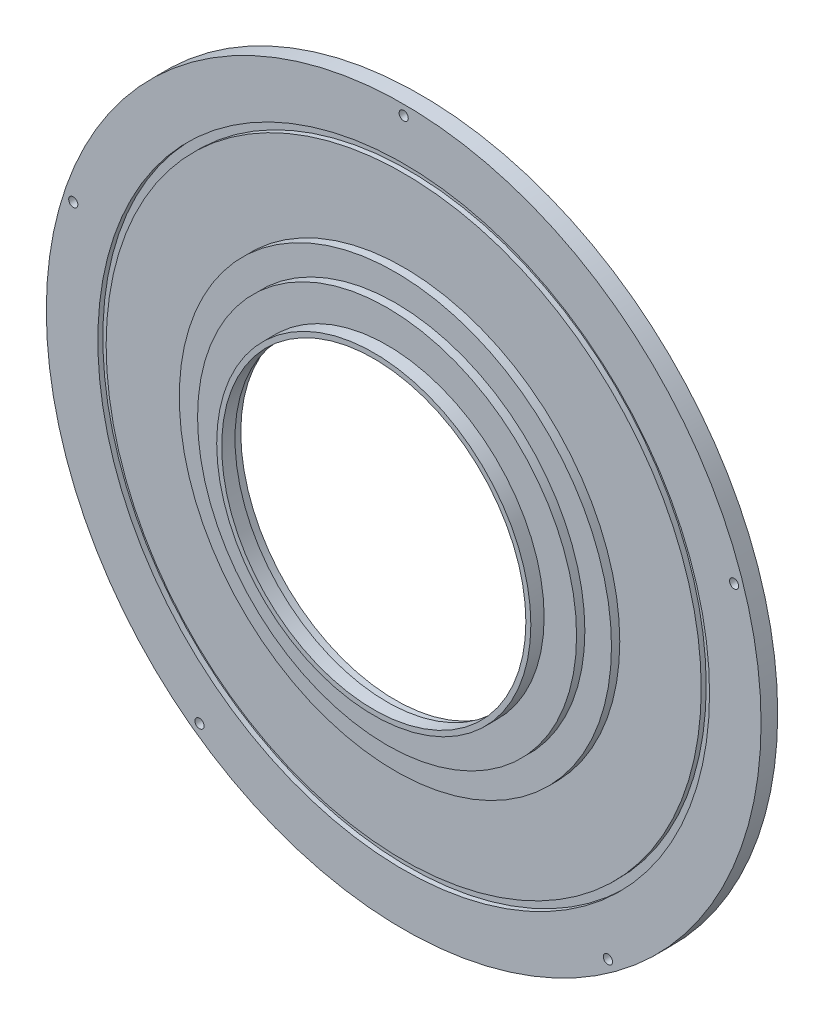
ISO-10303-21;
HEADER;
FILE_DESCRIPTION(('STEP AP214'),'2;1');
FILE_NAME('part.step','',(''),(''),'','','');
FILE_SCHEMA(('AUTOMOTIVE_DESIGN { 1 0 10303 214 1 1 1 1 }'));
ENDSEC;
DATA;
#1=APPLICATION_CONTEXT('core data for automotive mechanical design processes');
#2=APPLICATION_PROTOCOL_DEFINITION('international standard','automotive_design',2000,#1);
#3=PRODUCT_CONTEXT('',#1,'mechanical');
#4=PRODUCT('Part','Part','',(#3));
#5=PRODUCT_RELATED_PRODUCT_CATEGORY('part','',(#4));
#6=PRODUCT_DEFINITION_FORMATION('','',#4);
#7=PRODUCT_DEFINITION_CONTEXT('part definition',#1,'design');
#8=PRODUCT_DEFINITION('design','',#6,#7);
#9=PRODUCT_DEFINITION_SHAPE('','',#8);
#10=(LENGTH_UNIT() NAMED_UNIT(*) SI_UNIT(.MILLI.,.METRE.));
#11=(NAMED_UNIT(*) PLANE_ANGLE_UNIT() SI_UNIT($,.RADIAN.));
#12=(NAMED_UNIT(*) SI_UNIT($,.STERADIAN.) SOLID_ANGLE_UNIT());
#13=UNCERTAINTY_MEASURE_WITH_UNIT(LENGTH_MEASURE(1.E-05),#10,'distance_accuracy_value','');
#14=(GEOMETRIC_REPRESENTATION_CONTEXT(3) GLOBAL_UNCERTAINTY_ASSIGNED_CONTEXT((#13)) GLOBAL_UNIT_ASSIGNED_CONTEXT((#10,
#11,#12)) REPRESENTATION_CONTEXT('',''));
#15=CARTESIAN_POINT('',(0.,0.,0.));
#16=DIRECTION('',(0.,0.,1.));
#17=DIRECTION('',(1.,0.,0.));
#18=AXIS2_PLACEMENT_3D('',#15,#16,#17);
#19=CARTESIAN_POINT('',(0.,0.,10.));
#20=DIRECTION('',(0.,0.,1.));
#21=DIRECTION('',(1.,0.,0.));
#22=AXIS2_PLACEMENT_3D('',#19,#20,#21);
#23=PLANE('',#22);
#24=CARTESIAN_POINT('',(0.,0.,10.));
#25=DIRECTION('',(0.,0.,1.));
#26=DIRECTION('',(1.,0.,0.));
#27=AXIS2_PLACEMENT_3D('',#24,#25,#26);
#28=CIRCLE('',#27,130.);
#29=CARTESIAN_POINT('',(130.,0.,10.));
#30=VERTEX_POINT('',#29);
#31=EDGE_CURVE('E56',#30,#30,#28,.T.);
#32=ORIENTED_EDGE('',*,*,#31,.F.);
#33=EDGE_LOOP('',(#32));
#34=FACE_BOUND('',#33,.T.);
#35=CARTESIAN_POINT('',(0.,0.,10.));
#36=DIRECTION('',(0.,0.,1.));
#37=DIRECTION('',(1.,0.,0.));
#38=AXIS2_PLACEMENT_3D('',#35,#36,#37);
#39=CIRCLE('',#38,179.);
#40=CARTESIAN_POINT('',(179.,0.,10.));
#41=VERTEX_POINT('',#40);
#42=EDGE_CURVE('E107',#41,#41,#39,.T.);
#43=ORIENTED_EDGE('',*,*,#42,.T.);
#44=EDGE_LOOP('',(#43));
#45=FACE_BOUND('',#44,.T.);
#46=ADVANCED_FACE('F37',(#34,#45),#23,.T.);
#47=CARTESIAN_POINT('',(0.,0.,0.));
#48=DIRECTION('',(0.,0.,1.));
#49=DIRECTION('',(1.,0.,0.));
#50=AXIS2_PLACEMENT_3D('',#47,#48,#49);
#51=PLANE('',#50);
#52=CARTESIAN_POINT('',(0.,0.,0.));
#53=DIRECTION('',(0.,0.,1.));
#54=DIRECTION('',(1.,0.,0.));
#55=AXIS2_PLACEMENT_3D('',#52,#53,#54);
#56=CIRCLE('',#55,120.);
#57=CARTESIAN_POINT('',(120.,0.,0.));
#58=VERTEX_POINT('',#57);
#59=EDGE_CURVE('E48',#58,#58,#56,.T.);
#60=ORIENTED_EDGE('',*,*,#59,.T.);
#61=EDGE_LOOP('',(#60));
#62=FACE_BOUND('',#61,.T.);
#63=CARTESIAN_POINT('',(0.,0.,0.));
#64=DIRECTION('',(0.,0.,1.));
#65=DIRECTION('',(1.,0.,0.));
#66=AXIS2_PLACEMENT_3D('',#63,#64,#65);
#67=CIRCLE('',#66,144.);
#68=CARTESIAN_POINT('',(144.,0.,0.));
#69=VERTEX_POINT('',#68);
#70=EDGE_CURVE('E98',#69,#69,#67,.T.);
#71=ORIENTED_EDGE('',*,*,#70,.F.);
#72=EDGE_LOOP('',(#71));
#73=FACE_BOUND('',#72,.T.);
#74=ADVANCED_FACE('F153',(#62,#73),#51,.F.);
#75=CARTESIAN_POINT('',(198.770811905687,64.584551824364,10.));
#76=DIRECTION('',(0.,0.,1.));
#77=DIRECTION('',(1.,0.,0.));
#78=AXIS2_PLACEMENT_3D('',#75,#76,#77);
#79=CIRCLE('',#78,2.75);
#80=CARTESIAN_POINT('',(201.520811905687,64.584551824364,10.));
#81=VERTEX_POINT('',#80);
#82=EDGE_CURVE('E113',#81,#81,#79,.T.);
#83=ORIENTED_EDGE('',*,*,#82,.F.);
#84=EDGE_LOOP('',(#83));
#85=FACE_BOUND('',#84,.T.);
#86=CARTESIAN_POINT('',(0.,209.,10.));
#87=DIRECTION('',(0.,0.,1.));
#88=DIRECTION('',(1.,0.,0.));
#89=AXIS2_PLACEMENT_3D('',#86,#87,#88);
#90=CIRCLE('',#89,2.75);
#91=CARTESIAN_POINT('',(2.75000000000001,209.,10.));
#92=VERTEX_POINT('',#91);
#93=EDGE_CURVE('E134',#92,#92,#90,.T.);
#94=ORIENTED_EDGE('',*,*,#93,.F.);
#95=EDGE_LOOP('',(#94));
#96=FACE_BOUND('',#95,.T.);
#97=CARTESIAN_POINT('',(-198.770811905687,64.584551824364,10.));
#98=DIRECTION('',(0.,0.,1.));
#99=DIRECTION('',(1.,0.,0.));
#100=AXIS2_PLACEMENT_3D('',#97,#98,#99);
#101=CIRCLE('',#100,2.75);
#102=CARTESIAN_POINT('',(-196.020811905687,64.584551824364,10.));
#103=VERTEX_POINT('',#102);
#104=EDGE_CURVE('E128',#103,#103,#101,.T.);
#105=ORIENTED_EDGE('',*,*,#104,.F.);
#106=EDGE_LOOP('',(#105));
#107=FACE_BOUND('',#106,.T.);
#108=CARTESIAN_POINT('',(-122.847117729127,-169.084551824364,10.));
#109=DIRECTION('',(0.,0.,1.));
#110=DIRECTION('',(1.,0.,0.));
#111=AXIS2_PLACEMENT_3D('',#108,#109,#110);
#112=CIRCLE('',#111,2.75);
#113=CARTESIAN_POINT('',(-120.097117729127,-169.084551824364,10.));
#114=VERTEX_POINT('',#113);
#115=EDGE_CURVE('E122',#114,#114,#112,.T.);
#116=ORIENTED_EDGE('',*,*,#115,.F.);
#117=EDGE_LOOP('',(#116));
#118=FACE_BOUND('',#117,.T.);
#119=CARTESIAN_POINT('',(122.847117729127,-169.084551824364,10.));
#120=DIRECTION('',(0.,0.,1.));
#121=DIRECTION('',(1.,0.,0.));
#122=AXIS2_PLACEMENT_3D('',#119,#120,#121);
#123=CIRCLE('',#122,2.74999999999999);
#124=CARTESIAN_POINT('',(125.597117729127,-169.084551824364,10.));
#125=VERTEX_POINT('',#124);
#126=EDGE_CURVE('E116',#125,#125,#123,.T.);
#127=ORIENTED_EDGE('',*,*,#126,.F.);
#128=EDGE_LOOP('',(#127));
#129=FACE_BOUND('',#128,.T.);
#130=CARTESIAN_POINT('',(0.,0.,10.));
#131=DIRECTION('',(0.,0.,1.));
#132=DIRECTION('',(1.,0.,0.));
#133=AXIS2_PLACEMENT_3D('',#130,#131,#132);
#134=CIRCLE('',#133,184.);
#135=CARTESIAN_POINT('',(184.,0.,10.));
#136=VERTEX_POINT('',#135);
#137=EDGE_CURVE('E101',#136,#136,#134,.T.);
#138=ORIENTED_EDGE('',*,*,#137,.F.);
#139=EDGE_LOOP('',(#138));
#140=FACE_BOUND('',#139,.T.);
#141=CARTESIAN_POINT('',(0.,0.,10.));
#142=DIRECTION('',(0.,0.,1.));
#143=DIRECTION('',(1.,0.,0.));
#144=AXIS2_PLACEMENT_3D('',#141,#142,#143);
#145=CIRCLE('',#144,215.);
#146=CARTESIAN_POINT('',(215.,0.,10.));
#147=VERTEX_POINT('',#146);
#148=EDGE_CURVE('E10',#147,#147,#145,.T.);
#149=ORIENTED_EDGE('',*,*,#148,.T.);
#150=EDGE_LOOP('',(#149));
#151=FACE_BOUND('',#150,.T.);
#152=ADVANCED_FACE('F149',(#85,#96,#107,#118,#129,#140,#151),#23,.T.);
#153=CARTESIAN_POINT('',(198.770811905687,64.584551824364,0.));
#154=DIRECTION('',(0.,0.,1.));
#155=DIRECTION('',(1.,0.,0.));
#156=AXIS2_PLACEMENT_3D('',#153,#154,#155);
#157=CIRCLE('',#156,2.75);
#158=CARTESIAN_POINT('',(201.520811905687,64.584551824364,0.));
#159=VERTEX_POINT('',#158);
#160=EDGE_CURVE('E140',#159,#159,#157,.T.);
#161=ORIENTED_EDGE('',*,*,#160,.T.);
#162=EDGE_LOOP('',(#161));
#163=FACE_BOUND('',#162,.T.);
#164=CARTESIAN_POINT('',(0.,209.,0.));
#165=DIRECTION('',(0.,0.,1.));
#166=DIRECTION('',(1.,0.,0.));
#167=AXIS2_PLACEMENT_3D('',#164,#165,#166);
#168=CIRCLE('',#167,2.75);
#169=CARTESIAN_POINT('',(2.75000000000001,209.,0.));
#170=VERTEX_POINT('',#169);
#171=EDGE_CURVE('E137',#170,#170,#168,.T.);
#172=ORIENTED_EDGE('',*,*,#171,.T.);
#173=EDGE_LOOP('',(#172));
#174=FACE_BOUND('',#173,.T.);
#175=CARTESIAN_POINT('',(-198.770811905687,64.584551824364,0.));
#176=DIRECTION('',(0.,0.,1.));
#177=DIRECTION('',(1.,0.,0.));
#178=AXIS2_PLACEMENT_3D('',#175,#176,#177);
#179=CIRCLE('',#178,2.75);
#180=CARTESIAN_POINT('',(-196.020811905687,64.584551824364,0.));
#181=VERTEX_POINT('',#180);
#182=EDGE_CURVE('E131',#181,#181,#179,.T.);
#183=ORIENTED_EDGE('',*,*,#182,.T.);
#184=EDGE_LOOP('',(#183));
#185=FACE_BOUND('',#184,.T.);
#186=CARTESIAN_POINT('',(-122.847117729127,-169.084551824364,0.));
#187=DIRECTION('',(0.,0.,1.));
#188=DIRECTION('',(1.,0.,0.));
#189=AXIS2_PLACEMENT_3D('',#186,#187,#188);
#190=CIRCLE('',#189,2.75);
#191=CARTESIAN_POINT('',(-120.097117729127,-169.084551824364,0.));
#192=VERTEX_POINT('',#191);
#193=EDGE_CURVE('E125',#192,#192,#190,.T.);
#194=ORIENTED_EDGE('',*,*,#193,.T.);
#195=EDGE_LOOP('',(#194));
#196=FACE_BOUND('',#195,.T.);
#197=CARTESIAN_POINT('',(122.847117729127,-169.084551824364,0.));
#198=DIRECTION('',(0.,0.,1.));
#199=DIRECTION('',(1.,0.,0.));
#200=AXIS2_PLACEMENT_3D('',#197,#198,#199);
#201=CIRCLE('',#200,2.74999999999999);
#202=CARTESIAN_POINT('',(125.597117729127,-169.084551824364,0.));
#203=VERTEX_POINT('',#202);
#204=EDGE_CURVE('E119',#203,#203,#201,.T.);
#205=ORIENTED_EDGE('',*,*,#204,.T.);
#206=EDGE_LOOP('',(#205));
#207=FACE_BOUND('',#206,.T.);
#208=CARTESIAN_POINT('',(0.,0.,0.));
#209=DIRECTION('',(0.,0.,1.));
#210=DIRECTION('',(1.,0.,0.));
#211=AXIS2_PLACEMENT_3D('',#208,#209,#210);
#212=CIRCLE('',#211,204.);
#213=CARTESIAN_POINT('',(204.,0.,0.));
#214=VERTEX_POINT('',#213);
#215=EDGE_CURVE('E92',#214,#214,#212,.T.);
#216=ORIENTED_EDGE('',*,*,#215,.T.);
#217=EDGE_LOOP('',(#216));
#218=FACE_BOUND('',#217,.T.);
#219=CARTESIAN_POINT('',(0.,0.,0.));
#220=DIRECTION('',(0.,0.,1.));
#221=DIRECTION('',(1.,0.,0.));
#222=AXIS2_PLACEMENT_3D('',#219,#220,#221);
#223=CIRCLE('',#222,215.);
#224=CARTESIAN_POINT('',(215.,0.,0.));
#225=VERTEX_POINT('',#224);
#226=EDGE_CURVE('E41',#225,#225,#223,.T.);
#227=ORIENTED_EDGE('',*,*,#226,.F.);
#228=EDGE_LOOP('',(#227));
#229=FACE_BOUND('',#228,.T.);
#230=ADVANCED_FACE('F152',(#163,#174,#185,#196,#207,#218,#229),#51,.F.);
#231=CARTESIAN_POINT('',(0.,0.,10.));
#232=DIRECTION('',(0.,0.,-1.));
#233=DIRECTION('',(-1.,0.,0.));
#234=AXIS2_PLACEMENT_3D('',#231,#232,#233);
#235=CYLINDRICAL_SURFACE('',#234,215.);
#236=ORIENTED_EDGE('',*,*,#148,.F.);
#237=EDGE_LOOP('',(#236));
#238=FACE_BOUND('',#237,.T.);
#239=ORIENTED_EDGE('',*,*,#226,.T.);
#240=EDGE_LOOP('',(#239));
#241=FACE_BOUND('',#240,.T.);
#242=ADVANCED_FACE('F39',(#238,#241),#235,.T.);
#243=CARTESIAN_POINT('',(0.,0.,10.));
#244=DIRECTION('',(0.,0.,-1.));
#245=DIRECTION('',(-1.,0.,0.));
#246=AXIS2_PLACEMENT_3D('',#243,#244,#245);
#247=CYLINDRICAL_SURFACE('',#246,120.);
#248=CARTESIAN_POINT('',(0.,0.,10.));
#249=DIRECTION('',(0.,0.,1.));
#250=DIRECTION('',(1.,0.,0.));
#251=AXIS2_PLACEMENT_3D('',#248,#249,#250);
#252=CIRCLE('',#251,120.);
#253=CARTESIAN_POINT('',(120.,0.,10.));
#254=VERTEX_POINT('',#253);
#255=EDGE_CURVE('E52',#254,#254,#252,.T.);
#256=ORIENTED_EDGE('',*,*,#255,.T.);
#257=EDGE_LOOP('',(#256));
#258=FACE_BOUND('',#257,.T.);
#259=ORIENTED_EDGE('',*,*,#59,.F.);
#260=EDGE_LOOP('',(#259));
#261=FACE_BOUND('',#260,.T.);
#262=ADVANCED_FACE('F200',(#258,#261),#247,.F.);
#263=CARTESIAN_POINT('',(0.,0.,10.));
#264=DIRECTION('',(0.,0.,1.));
#265=DIRECTION('',(1.,0.,0.));
#266=AXIS2_PLACEMENT_3D('',#263,#264,#265);
#267=PLANE('',#266);
#268=CARTESIAN_POINT('',(0.,0.,10.));
#269=DIRECTION('',(0.,0.,1.));
#270=DIRECTION('',(1.,0.,0.));
#271=AXIS2_PLACEMENT_3D('',#268,#269,#270);
#272=CIRCLE('',#271,111.);
#273=CARTESIAN_POINT('',(111.,0.,10.));
#274=VERTEX_POINT('',#273);
#275=EDGE_CURVE('E59',#274,#274,#272,.T.);
#276=ORIENTED_EDGE('',*,*,#275,.T.);
#277=EDGE_LOOP('',(#276));
#278=FACE_BOUND('',#277,.T.);
#279=ORIENTED_EDGE('',*,*,#255,.F.);
#280=EDGE_LOOP('',(#279));
#281=FACE_BOUND('',#280,.T.);
#282=ADVANCED_FACE('F276',(#278,#281),#267,.F.);
#283=CARTESIAN_POINT('',(0.,0.,15.));
#284=DIRECTION('',(0.,0.,1.));
#285=DIRECTION('',(1.,0.,0.));
#286=AXIS2_PLACEMENT_3D('',#283,#284,#285);
#287=PLANE('',#286);
#288=CARTESIAN_POINT('',(0.,0.,15.));
#289=DIRECTION('',(0.,0.,1.));
#290=DIRECTION('',(1.,0.,0.));
#291=AXIS2_PLACEMENT_3D('',#288,#289,#290);
#292=CIRCLE('',#291,114.);
#293=CARTESIAN_POINT('',(114.,0.,15.));
#294=VERTEX_POINT('',#293);
#295=EDGE_CURVE('E68',#294,#294,#292,.T.);
#296=ORIENTED_EDGE('',*,*,#295,.F.);
#297=EDGE_LOOP('',(#296));
#298=FACE_BOUND('',#297,.T.);
#299=CARTESIAN_POINT('',(0.,0.,15.));
#300=DIRECTION('',(0.,0.,1.));
#301=DIRECTION('',(1.,0.,0.));
#302=AXIS2_PLACEMENT_3D('',#299,#300,#301);
#303=CIRCLE('',#302,130.);
#304=CARTESIAN_POINT('',(130.,0.,15.));
#305=VERTEX_POINT('',#304);
#306=EDGE_CURVE('E55',#305,#305,#303,.T.);
#307=ORIENTED_EDGE('',*,*,#306,.T.);
#308=EDGE_LOOP('',(#307));
#309=FACE_BOUND('',#308,.T.);
#310=ADVANCED_FACE('F273',(#298,#309),#287,.T.);
#311=CARTESIAN_POINT('',(0.,0.,15.));
#312=DIRECTION('',(0.,0.,-1.));
#313=DIRECTION('',(-1.,0.,0.));
#314=AXIS2_PLACEMENT_3D('',#311,#312,#313);
#315=CYLINDRICAL_SURFACE('',#314,130.);
#316=ORIENTED_EDGE('',*,*,#306,.F.);
#317=EDGE_LOOP('',(#316));
#318=FACE_BOUND('',#317,.T.);
#319=ORIENTED_EDGE('',*,*,#31,.T.);
#320=EDGE_LOOP('',(#319));
#321=FACE_BOUND('',#320,.T.);
#322=ADVANCED_FACE('F271',(#318,#321),#315,.T.);
#323=CARTESIAN_POINT('',(0.,0.,15.));
#324=DIRECTION('',(0.,0.,-1.));
#325=DIRECTION('',(-1.,0.,0.));
#326=AXIS2_PLACEMENT_3D('',#323,#324,#325);
#327=CYLINDRICAL_SURFACE('',#326,111.);
#328=CARTESIAN_POINT('',(0.,0.,15.));
#329=DIRECTION('',(0.,0.,1.));
#330=DIRECTION('',(1.,0.,0.));
#331=AXIS2_PLACEMENT_3D('',#328,#329,#330);
#332=CIRCLE('',#331,111.);
#333=CARTESIAN_POINT('',(111.,0.,15.));
#334=VERTEX_POINT('',#333);
#335=EDGE_CURVE('E64',#334,#334,#332,.T.);
#336=ORIENTED_EDGE('',*,*,#335,.T.);
#337=EDGE_LOOP('',(#336));
#338=FACE_BOUND('',#337,.T.);
#339=ORIENTED_EDGE('',*,*,#275,.F.);
#340=EDGE_LOOP('',(#339));
#341=FACE_BOUND('',#340,.T.);
#342=ADVANCED_FACE('F264',(#338,#341),#327,.F.);
#343=CARTESIAN_POINT('',(0.,0.,15.));
#344=DIRECTION('',(0.,0.,1.));
#345=DIRECTION('',(1.,0.,0.));
#346=AXIS2_PLACEMENT_3D('',#343,#344,#345);
#347=PLANE('',#346);
#348=CARTESIAN_POINT('',(0.,0.,15.));
#349=DIRECTION('',(0.,0.,1.));
#350=DIRECTION('',(1.,0.,0.));
#351=AXIS2_PLACEMENT_3D('',#348,#349,#350);
#352=CIRCLE('',#351,93.);
#353=CARTESIAN_POINT('',(93.,0.,15.));
#354=VERTEX_POINT('',#353);
#355=EDGE_CURVE('E71',#354,#354,#352,.T.);
#356=ORIENTED_EDGE('',*,*,#355,.T.);
#357=EDGE_LOOP('',(#356));
#358=FACE_BOUND('',#357,.T.);
#359=ORIENTED_EDGE('',*,*,#335,.F.);
#360=EDGE_LOOP('',(#359));
#361=FACE_BOUND('',#360,.T.);
#362=ADVANCED_FACE('F260',(#358,#361),#347,.F.);
#363=CARTESIAN_POINT('',(0.,0.,20.));
#364=DIRECTION('',(0.,0.,1.));
#365=DIRECTION('',(1.,0.,0.));
#366=AXIS2_PLACEMENT_3D('',#363,#364,#365);
#367=PLANE('',#366);
#368=CARTESIAN_POINT('',(0.,0.,20.));
#369=DIRECTION('',(0.,0.,1.));
#370=DIRECTION('',(1.,0.,0.));
#371=AXIS2_PLACEMENT_3D('',#368,#369,#370);
#372=CIRCLE('',#371,94.5);
#373=CARTESIAN_POINT('',(94.5,0.,20.));
#374=VERTEX_POINT('',#373);
#375=EDGE_CURVE('E80',#374,#374,#372,.T.);
#376=ORIENTED_EDGE('',*,*,#375,.F.);
#377=EDGE_LOOP('',(#376));
#378=FACE_BOUND('',#377,.T.);
#379=CARTESIAN_POINT('',(0.,0.,20.));
#380=DIRECTION('',(0.,0.,1.));
#381=DIRECTION('',(1.,0.,0.));
#382=AXIS2_PLACEMENT_3D('',#379,#380,#381);
#383=CIRCLE('',#382,114.);
#384=CARTESIAN_POINT('',(114.,0.,20.));
#385=VERTEX_POINT('',#384);
#386=EDGE_CURVE('E67',#385,#385,#383,.T.);
#387=ORIENTED_EDGE('',*,*,#386,.T.);
#388=EDGE_LOOP('',(#387));
#389=FACE_BOUND('',#388,.T.);
#390=ADVANCED_FACE('F257',(#378,#389),#367,.T.);
#391=CARTESIAN_POINT('',(0.,0.,20.));
#392=DIRECTION('',(0.,0.,-1.));
#393=DIRECTION('',(-1.,0.,0.));
#394=AXIS2_PLACEMENT_3D('',#391,#392,#393);
#395=CYLINDRICAL_SURFACE('',#394,114.);
#396=ORIENTED_EDGE('',*,*,#386,.F.);
#397=EDGE_LOOP('',(#396));
#398=FACE_BOUND('',#397,.T.);
#399=ORIENTED_EDGE('',*,*,#295,.T.);
#400=EDGE_LOOP('',(#399));
#401=FACE_BOUND('',#400,.T.);
#402=ADVANCED_FACE('F255',(#398,#401),#395,.T.);
#403=CARTESIAN_POINT('',(0.,0.,20.));
#404=DIRECTION('',(0.,0.,-1.));
#405=DIRECTION('',(-1.,0.,0.));
#406=AXIS2_PLACEMENT_3D('',#403,#404,#405);
#407=CYLINDRICAL_SURFACE('',#406,93.);
#408=CARTESIAN_POINT('',(0.,0.,20.));
#409=DIRECTION('',(0.,0.,1.));
#410=DIRECTION('',(1.,0.,0.));
#411=AXIS2_PLACEMENT_3D('',#408,#409,#410);
#412=CIRCLE('',#411,93.);
#413=CARTESIAN_POINT('',(93.,0.,20.));
#414=VERTEX_POINT('',#413);
#415=EDGE_CURVE('E76',#414,#414,#412,.T.);
#416=ORIENTED_EDGE('',*,*,#415,.T.);
#417=EDGE_LOOP('',(#416));
#418=FACE_BOUND('',#417,.T.);
#419=ORIENTED_EDGE('',*,*,#355,.F.);
#420=EDGE_LOOP('',(#419));
#421=FACE_BOUND('',#420,.T.);
#422=ADVANCED_FACE('F248',(#418,#421),#407,.F.);
#423=CARTESIAN_POINT('',(0.,0.,20.));
#424=DIRECTION('',(0.,0.,1.));
#425=DIRECTION('',(1.,0.,0.));
#426=AXIS2_PLACEMENT_3D('',#423,#424,#425);
#427=PLANE('',#426);
#428=CARTESIAN_POINT('',(0.,0.,20.));
#429=DIRECTION('',(0.,0.,1.));
#430=DIRECTION('',(1.,0.,0.));
#431=AXIS2_PLACEMENT_3D('',#428,#429,#430);
#432=CIRCLE('',#431,91.5);
#433=CARTESIAN_POINT('',(91.5,0.,20.));
#434=VERTEX_POINT('',#433);
#435=EDGE_CURVE('E86',#434,#434,#432,.T.);
#436=ORIENTED_EDGE('',*,*,#435,.T.);
#437=EDGE_LOOP('',(#436));
#438=FACE_BOUND('',#437,.T.);
#439=ORIENTED_EDGE('',*,*,#415,.F.);
#440=EDGE_LOOP('',(#439));
#441=FACE_BOUND('',#440,.T.);
#442=ADVANCED_FACE('F244',(#438,#441),#427,.F.);
#443=CARTESIAN_POINT('',(0.,0.,28.));
#444=DIRECTION('',(0.,0.,1.));
#445=DIRECTION('',(1.,0.,0.));
#446=AXIS2_PLACEMENT_3D('',#443,#444,#445);
#447=PLANE('',#446);
#448=CARTESIAN_POINT('',(0.,0.,28.));
#449=DIRECTION('',(0.,0.,1.));
#450=DIRECTION('',(1.,0.,0.));
#451=AXIS2_PLACEMENT_3D('',#448,#449,#450);
#452=CIRCLE('',#451,94.5);
#453=CARTESIAN_POINT('',(94.5,0.,28.));
#454=VERTEX_POINT('',#453);
#455=EDGE_CURVE('E79',#454,#454,#452,.T.);
#456=ORIENTED_EDGE('',*,*,#455,.T.);
#457=EDGE_LOOP('',(#456));
#458=FACE_BOUND('',#457,.T.);
#459=CARTESIAN_POINT('',(0.,0.,28.));
#460=DIRECTION('',(0.,0.,1.));
#461=DIRECTION('',(1.,0.,0.));
#462=AXIS2_PLACEMENT_3D('',#459,#460,#461);
#463=CIRCLE('',#462,91.5);
#464=CARTESIAN_POINT('',(91.5,0.,28.));
#465=VERTEX_POINT('',#464);
#466=EDGE_CURVE('E83',#465,#465,#463,.T.);
#467=ORIENTED_EDGE('',*,*,#466,.F.);
#468=EDGE_LOOP('',(#467));
#469=FACE_BOUND('',#468,.T.);
#470=ADVANCED_FACE('F241',(#458,#469),#447,.T.);
#471=CARTESIAN_POINT('',(0.,0.,28.));
#472=DIRECTION('',(0.,0.,-1.));
#473=DIRECTION('',(-1.,0.,0.));
#474=AXIS2_PLACEMENT_3D('',#471,#472,#473);
#475=CYLINDRICAL_SURFACE('',#474,94.5);
#476=ORIENTED_EDGE('',*,*,#455,.F.);
#477=EDGE_LOOP('',(#476));
#478=FACE_BOUND('',#477,.T.);
#479=ORIENTED_EDGE('',*,*,#375,.T.);
#480=EDGE_LOOP('',(#479));
#481=FACE_BOUND('',#480,.T.);
#482=ADVANCED_FACE('F239',(#478,#481),#475,.T.);
#483=CARTESIAN_POINT('',(0.,0.,28.));
#484=DIRECTION('',(0.,0.,-1.));
#485=DIRECTION('',(-1.,0.,0.));
#486=AXIS2_PLACEMENT_3D('',#483,#484,#485);
#487=CYLINDRICAL_SURFACE('',#486,91.5);
#488=ORIENTED_EDGE('',*,*,#466,.T.);
#489=EDGE_LOOP('',(#488));
#490=FACE_BOUND('',#489,.T.);
#491=ORIENTED_EDGE('',*,*,#435,.F.);
#492=EDGE_LOOP('',(#491));
#493=FACE_BOUND('',#492,.T.);
#494=ADVANCED_FACE('F233',(#490,#493),#487,.F.);
#495=CARTESIAN_POINT('',(0.,0.,4.));
#496=DIRECTION('',(0.,0.,1.));
#497=DIRECTION('',(1.,0.,0.));
#498=AXIS2_PLACEMENT_3D('',#495,#496,#497);
#499=PLANE('',#498);
#500=CARTESIAN_POINT('',(0.,0.,4.));
#501=DIRECTION('',(0.,0.,1.));
#502=DIRECTION('',(1.,0.,0.));
#503=AXIS2_PLACEMENT_3D('',#500,#501,#502);
#504=CIRCLE('',#503,204.);
#505=CARTESIAN_POINT('',(204.,0.,4.));
#506=VERTEX_POINT('',#505);
#507=EDGE_CURVE('E89',#506,#506,#504,.T.);
#508=ORIENTED_EDGE('',*,*,#507,.F.);
#509=EDGE_LOOP('',(#508));
#510=FACE_BOUND('',#509,.T.);
#511=CARTESIAN_POINT('',(0.,0.,4.));
#512=DIRECTION('',(0.,0.,1.));
#513=DIRECTION('',(1.,0.,0.));
#514=AXIS2_PLACEMENT_3D('',#511,#512,#513);
#515=CIRCLE('',#514,144.);
#516=CARTESIAN_POINT('',(144.,0.,4.));
#517=VERTEX_POINT('',#516);
#518=EDGE_CURVE('E95',#517,#517,#515,.T.);
#519=ORIENTED_EDGE('',*,*,#518,.T.);
#520=EDGE_LOOP('',(#519));
#521=FACE_BOUND('',#520,.T.);
#522=ADVANCED_FACE('F225',(#510,#521),#499,.F.);
#523=CARTESIAN_POINT('',(0.,0.,4.));
#524=DIRECTION('',(0.,0.,-1.));
#525=DIRECTION('',(-1.,0.,0.));
#526=AXIS2_PLACEMENT_3D('',#523,#524,#525);
#527=CYLINDRICAL_SURFACE('',#526,204.);
#528=ORIENTED_EDGE('',*,*,#507,.T.);
#529=EDGE_LOOP('',(#528));
#530=FACE_BOUND('',#529,.T.);
#531=ORIENTED_EDGE('',*,*,#215,.F.);
#532=EDGE_LOOP('',(#531));
#533=FACE_BOUND('',#532,.T.);
#534=ADVANCED_FACE('F223',(#530,#533),#527,.F.);
#535=CARTESIAN_POINT('',(0.,0.,4.));
#536=DIRECTION('',(0.,0.,-1.));
#537=DIRECTION('',(-1.,0.,0.));
#538=AXIS2_PLACEMENT_3D('',#535,#536,#537);
#539=CYLINDRICAL_SURFACE('',#538,144.);
#540=ORIENTED_EDGE('',*,*,#518,.F.);
#541=EDGE_LOOP('',(#540));
#542=FACE_BOUND('',#541,.T.);
#543=ORIENTED_EDGE('',*,*,#70,.T.);
#544=EDGE_LOOP('',(#543));
#545=FACE_BOUND('',#544,.T.);
#546=ADVANCED_FACE('F175',(#542,#545),#539,.T.);
#547=CARTESIAN_POINT('',(0.,0.,7.));
#548=DIRECTION('',(0.,0.,1.));
#549=DIRECTION('',(1.,0.,0.));
#550=AXIS2_PLACEMENT_3D('',#547,#548,#549);
#551=PLANE('',#550);
#552=CARTESIAN_POINT('',(0.,0.,7.));
#553=DIRECTION('',(0.,0.,1.));
#554=DIRECTION('',(1.,0.,0.));
#555=AXIS2_PLACEMENT_3D('',#552,#553,#554);
#556=CIRCLE('',#555,184.);
#557=CARTESIAN_POINT('',(184.,0.,7.));
#558=VERTEX_POINT('',#557);
#559=EDGE_CURVE('E104',#558,#558,#556,.T.);
#560=ORIENTED_EDGE('',*,*,#559,.T.);
#561=EDGE_LOOP('',(#560));
#562=FACE_BOUND('',#561,.T.);
#563=CARTESIAN_POINT('',(0.,0.,7.));
#564=DIRECTION('',(0.,0.,1.));
#565=DIRECTION('',(1.,0.,0.));
#566=AXIS2_PLACEMENT_3D('',#563,#564,#565);
#567=CIRCLE('',#566,179.);
#568=CARTESIAN_POINT('',(179.,0.,7.));
#569=VERTEX_POINT('',#568);
#570=EDGE_CURVE('E110',#569,#569,#567,.T.);
#571=ORIENTED_EDGE('',*,*,#570,.F.);
#572=EDGE_LOOP('',(#571));
#573=FACE_BOUND('',#572,.T.);
#574=ADVANCED_FACE('F169',(#562,#573),#551,.T.);
#575=CARTESIAN_POINT('',(0.,0.,10.));
#576=DIRECTION('',(0.,0.,-1.));
#577=DIRECTION('',(-1.,0.,0.));
#578=AXIS2_PLACEMENT_3D('',#575,#576,#577);
#579=CYLINDRICAL_SURFACE('',#578,184.);
#580=ORIENTED_EDGE('',*,*,#137,.T.);
#581=EDGE_LOOP('',(#580));
#582=FACE_BOUND('',#581,.T.);
#583=ORIENTED_EDGE('',*,*,#559,.F.);
#584=EDGE_LOOP('',(#583));
#585=FACE_BOUND('',#584,.T.);
#586=ADVANCED_FACE('F165',(#582,#585),#579,.F.);
#587=CARTESIAN_POINT('',(0.,0.,10.));
#588=DIRECTION('',(0.,0.,-1.));
#589=DIRECTION('',(-1.,0.,0.));
#590=AXIS2_PLACEMENT_3D('',#587,#588,#589);
#591=CYLINDRICAL_SURFACE('',#590,179.);
#592=ORIENTED_EDGE('',*,*,#42,.F.);
#593=EDGE_LOOP('',(#592));
#594=FACE_BOUND('',#593,.T.);
#595=ORIENTED_EDGE('',*,*,#570,.T.);
#596=EDGE_LOOP('',(#595));
#597=FACE_BOUND('',#596,.T.);
#598=ADVANCED_FACE('F168',(#594,#597),#591,.T.);
#599=CARTESIAN_POINT('',(122.847117729127,-169.084551824364,10.));
#600=DIRECTION('',(0.,0.,-1.));
#601=DIRECTION('',(-1.,0.,0.));
#602=AXIS2_PLACEMENT_3D('',#599,#600,#601);
#603=CYLINDRICAL_SURFACE('',#602,2.74999999999999);
#604=ORIENTED_EDGE('',*,*,#126,.T.);
#605=EDGE_LOOP('',(#604));
#606=FACE_BOUND('',#605,.T.);
#607=ORIENTED_EDGE('',*,*,#204,.F.);
#608=EDGE_LOOP('',(#607));
#609=FACE_BOUND('',#608,.T.);
#610=ADVANCED_FACE('F180',(#606,#609),#603,.F.);
#611=CARTESIAN_POINT('',(-122.847117729127,-169.084551824364,10.));
#612=DIRECTION('',(0.,0.,-1.));
#613=DIRECTION('',(-1.,0.,0.));
#614=AXIS2_PLACEMENT_3D('',#611,#612,#613);
#615=CYLINDRICAL_SURFACE('',#614,2.75);
#616=ORIENTED_EDGE('',*,*,#115,.T.);
#617=EDGE_LOOP('',(#616));
#618=FACE_BOUND('',#617,.T.);
#619=ORIENTED_EDGE('',*,*,#193,.F.);
#620=EDGE_LOOP('',(#619));
#621=FACE_BOUND('',#620,.T.);
#622=ADVANCED_FACE('F186',(#618,#621),#615,.F.);
#623=CARTESIAN_POINT('',(-198.770811905687,64.584551824364,10.));
#624=DIRECTION('',(0.,0.,-1.));
#625=DIRECTION('',(-1.,0.,0.));
#626=AXIS2_PLACEMENT_3D('',#623,#624,#625);
#627=CYLINDRICAL_SURFACE('',#626,2.75);
#628=ORIENTED_EDGE('',*,*,#104,.T.);
#629=EDGE_LOOP('',(#628));
#630=FACE_BOUND('',#629,.T.);
#631=ORIENTED_EDGE('',*,*,#182,.F.);
#632=EDGE_LOOP('',(#631));
#633=FACE_BOUND('',#632,.T.);
#634=ADVANCED_FACE('F397',(#630,#633),#627,.F.);
#635=CARTESIAN_POINT('',(0.,209.,10.));
#636=DIRECTION('',(0.,0.,-1.));
#637=DIRECTION('',(-1.,0.,0.));
#638=AXIS2_PLACEMENT_3D('',#635,#636,#637);
#639=CYLINDRICAL_SURFACE('',#638,2.75);
#640=ORIENTED_EDGE('',*,*,#93,.T.);
#641=EDGE_LOOP('',(#640));
#642=FACE_BOUND('',#641,.T.);
#643=ORIENTED_EDGE('',*,*,#171,.F.);
#644=EDGE_LOOP('',(#643));
#645=FACE_BOUND('',#644,.T.);
#646=ADVANCED_FACE('F407',(#642,#645),#639,.F.);
#647=CARTESIAN_POINT('',(198.770811905687,64.584551824364,10.));
#648=DIRECTION('',(0.,0.,-1.));
#649=DIRECTION('',(-1.,0.,0.));
#650=AXIS2_PLACEMENT_3D('',#647,#648,#649);
#651=CYLINDRICAL_SURFACE('',#650,2.75);
#652=ORIENTED_EDGE('',*,*,#82,.T.);
#653=EDGE_LOOP('',(#652));
#654=FACE_BOUND('',#653,.T.);
#655=ORIENTED_EDGE('',*,*,#160,.F.);
#656=EDGE_LOOP('',(#655));
#657=FACE_BOUND('',#656,.T.);
#658=ADVANCED_FACE('F146',(#654,#657),#651,.F.);
#659=CLOSED_SHELL('',(#46,#74,#152,#230,#242,#262,#282,#310,#322,#342,#362,#390,#402,#422,#442,
#470,#482,#494,#522,#534,#546,#574,#586,#598,#610,#622,#634,#646,#658));
#660=MANIFOLD_SOLID_BREP('B2',#659);
#661=ADVANCED_BREP_SHAPE_REPRESENTATION('',(#18,#660),#14);
#662=SHAPE_DEFINITION_REPRESENTATION(#9,#661);
ENDSEC;
END-ISO-10303-21;
